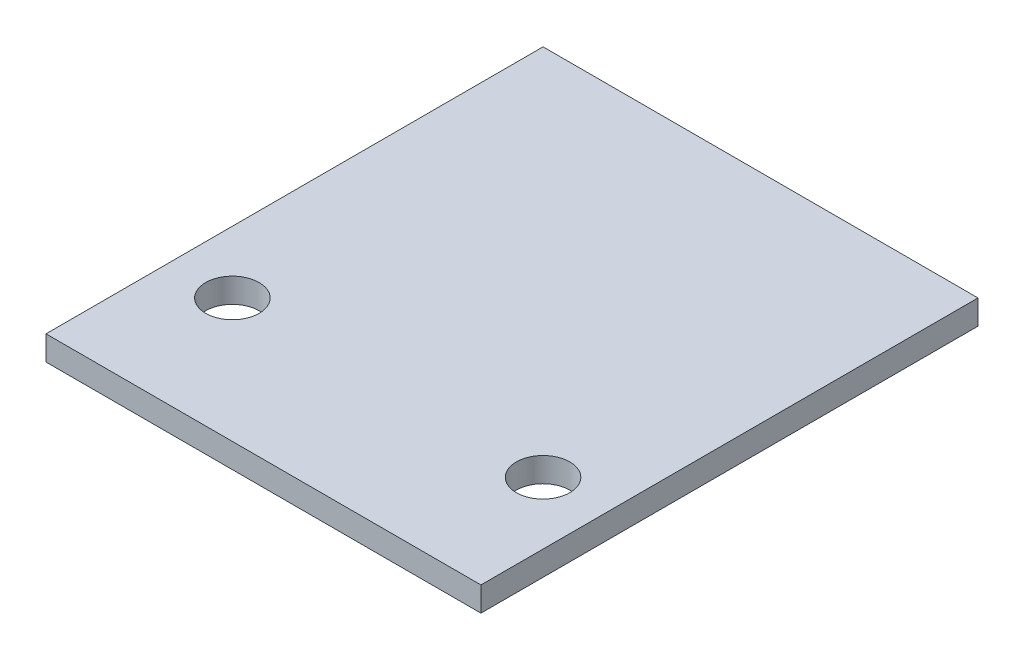
ISO-10303-21;
HEADER;
FILE_DESCRIPTION(('STEP AP214'),'2;1');
FILE_NAME('part.step','',(''),(''),'','','');
FILE_SCHEMA(('AUTOMOTIVE_DESIGN { 1 0 10303 214 1 1 1 1 }'));
ENDSEC;
DATA;
#1=APPLICATION_CONTEXT('core data for automotive mechanical design processes');
#2=APPLICATION_PROTOCOL_DEFINITION('international standard','automotive_design',2000,#1);
#3=PRODUCT_CONTEXT('',#1,'mechanical');
#4=PRODUCT('Part','Part','',(#3));
#5=PRODUCT_RELATED_PRODUCT_CATEGORY('part','',(#4));
#6=PRODUCT_DEFINITION_FORMATION('','',#4);
#7=PRODUCT_DEFINITION_CONTEXT('part definition',#1,'design');
#8=PRODUCT_DEFINITION('design','',#6,#7);
#9=PRODUCT_DEFINITION_SHAPE('','',#8);
#10=(LENGTH_UNIT() NAMED_UNIT(*) SI_UNIT(.MILLI.,.METRE.));
#11=(NAMED_UNIT(*) PLANE_ANGLE_UNIT() SI_UNIT($,.RADIAN.));
#12=(NAMED_UNIT(*) SI_UNIT($,.STERADIAN.) SOLID_ANGLE_UNIT());
#13=UNCERTAINTY_MEASURE_WITH_UNIT(LENGTH_MEASURE(1.E-05),#10,'distance_accuracy_value','');
#14=(GEOMETRIC_REPRESENTATION_CONTEXT(3) GLOBAL_UNCERTAINTY_ASSIGNED_CONTEXT((#13)) GLOBAL_UNIT_ASSIGNED_CONTEXT((#10,
#11,#12)) REPRESENTATION_CONTEXT('',''));
#15=CARTESIAN_POINT('',(0.,0.,0.));
#16=DIRECTION('',(0.,0.,1.));
#17=DIRECTION('',(1.,0.,0.));
#18=AXIS2_PLACEMENT_3D('',#15,#16,#17);
#19=CARTESIAN_POINT('',(8.89,1.,-10.16));
#20=DIRECTION('',(-1.,0.,0.));
#21=DIRECTION('',(0.,0.,1.));
#22=AXIS2_PLACEMENT_3D('',#19,#20,#21);
#23=PLANE('',#22);
#24=DIRECTION('',(0.,0.,-1.));
#25=VECTOR('',#24,1.);
#26=CARTESIAN_POINT('',(8.89,0.,-10.16));
#27=LINE('',#26,#25);
#28=CARTESIAN_POINT('',(8.89,0.,10.16));
#29=VERTEX_POINT('',#28);
#30=CARTESIAN_POINT('',(8.89,0.,-10.16));
#31=VERTEX_POINT('',#30);
#32=EDGE_CURVE('E95',#29,#31,#27,.T.);
#33=ORIENTED_EDGE('',*,*,#32,.T.);
#34=DIRECTION('',(0.,-1.,0.));
#35=VECTOR('',#34,1.);
#36=CARTESIAN_POINT('',(8.89,1.,-10.16));
#37=LINE('',#36,#35);
#38=CARTESIAN_POINT('',(8.89,1.,-10.16));
#39=VERTEX_POINT('',#38);
#40=EDGE_CURVE('E11',#39,#31,#37,.T.);
#41=ORIENTED_EDGE('',*,*,#40,.F.);
#42=DIRECTION('',(0.,0.,-1.));
#43=VECTOR('',#42,1.);
#44=CARTESIAN_POINT('',(8.89,1.,-10.16));
#45=LINE('',#44,#43);
#46=CARTESIAN_POINT('',(8.89,1.,10.16));
#47=VERTEX_POINT('',#46);
#48=EDGE_CURVE('E83',#47,#39,#45,.T.);
#49=ORIENTED_EDGE('',*,*,#48,.F.);
#50=DIRECTION('',(0.,-1.,0.));
#51=VECTOR('',#50,1.);
#52=CARTESIAN_POINT('',(8.89,1.,10.16));
#53=LINE('',#52,#51);
#54=EDGE_CURVE('E91',#47,#29,#53,.T.);
#55=ORIENTED_EDGE('',*,*,#54,.T.);
#56=EDGE_LOOP('',(#33,#41,#49,#55));
#57=FACE_BOUND('',#56,.T.);
#58=ADVANCED_FACE('F32',(#57),#23,.F.);
#59=CARTESIAN_POINT('',(-8.89,1.,-10.16));
#60=DIRECTION('',(0.,0.,1.));
#61=DIRECTION('',(1.,0.,0.));
#62=AXIS2_PLACEMENT_3D('',#59,#60,#61);
#63=PLANE('',#62);
#64=DIRECTION('',(-1.,0.,0.));
#65=VECTOR('',#64,1.);
#66=CARTESIAN_POINT('',(-8.89,0.,-10.16));
#67=LINE('',#66,#65);
#68=CARTESIAN_POINT('',(-8.89,0.,-10.16));
#69=VERTEX_POINT('',#68);
#70=EDGE_CURVE('E87',#31,#69,#67,.T.);
#71=ORIENTED_EDGE('',*,*,#70,.T.);
#72=DIRECTION('',(0.,-1.,0.));
#73=VECTOR('',#72,1.);
#74=CARTESIAN_POINT('',(-8.89,1.,-10.16));
#75=LINE('',#74,#73);
#76=CARTESIAN_POINT('',(-8.89,1.,-10.16));
#77=VERTEX_POINT('',#76);
#78=EDGE_CURVE('E40',#77,#69,#75,.T.);
#79=ORIENTED_EDGE('',*,*,#78,.F.);
#80=DIRECTION('',(-1.,0.,0.));
#81=VECTOR('',#80,1.);
#82=CARTESIAN_POINT('',(-8.89,1.,-10.16));
#83=LINE('',#82,#81);
#84=EDGE_CURVE('E78',#39,#77,#83,.T.);
#85=ORIENTED_EDGE('',*,*,#84,.F.);
#86=ORIENTED_EDGE('',*,*,#40,.T.);
#87=EDGE_LOOP('',(#71,#79,#85,#86));
#88=FACE_BOUND('',#87,.T.);
#89=ADVANCED_FACE('F86',(#88),#63,.F.);
#90=CARTESIAN_POINT('',(-8.89,1.,-10.16));
#91=DIRECTION('',(1.,0.,0.));
#92=DIRECTION('',(0.,0.,-1.));
#93=AXIS2_PLACEMENT_3D('',#90,#91,#92);
#94=PLANE('',#93);
#95=DIRECTION('',(0.,0.,1.));
#96=VECTOR('',#95,1.);
#97=CARTESIAN_POINT('',(-8.89,0.,-10.16));
#98=LINE('',#97,#96);
#99=CARTESIAN_POINT('',(-8.89,0.,10.16));
#100=VERTEX_POINT('',#99);
#101=EDGE_CURVE('E65',#69,#100,#98,.T.);
#102=ORIENTED_EDGE('',*,*,#101,.T.);
#103=DIRECTION('',(0.,-1.,0.));
#104=VECTOR('',#103,1.);
#105=CARTESIAN_POINT('',(-8.89,1.,10.16));
#106=LINE('',#105,#104);
#107=CARTESIAN_POINT('',(-8.89,1.,10.16));
#108=VERTEX_POINT('',#107);
#109=EDGE_CURVE('E88',#108,#100,#106,.T.);
#110=ORIENTED_EDGE('',*,*,#109,.F.);
#111=DIRECTION('',(0.,0.,1.));
#112=VECTOR('',#111,1.);
#113=CARTESIAN_POINT('',(-8.89,1.,-10.16));
#114=LINE('',#113,#112);
#115=EDGE_CURVE('E81',#77,#108,#114,.T.);
#116=ORIENTED_EDGE('',*,*,#115,.F.);
#117=ORIENTED_EDGE('',*,*,#78,.T.);
#118=EDGE_LOOP('',(#102,#110,#116,#117));
#119=FACE_BOUND('',#118,.T.);
#120=ADVANCED_FACE('F89',(#119),#94,.F.);
#121=CARTESIAN_POINT('',(-8.89,1.,10.16));
#122=DIRECTION('',(0.,0.,-1.));
#123=DIRECTION('',(-1.,0.,0.));
#124=AXIS2_PLACEMENT_3D('',#121,#122,#123);
#125=PLANE('',#124);
#126=DIRECTION('',(1.,0.,0.));
#127=VECTOR('',#126,1.);
#128=CARTESIAN_POINT('',(-8.89,0.,10.16));
#129=LINE('',#128,#127);
#130=EDGE_CURVE('E71',#100,#29,#129,.T.);
#131=ORIENTED_EDGE('',*,*,#130,.T.);
#132=ORIENTED_EDGE('',*,*,#54,.F.);
#133=DIRECTION('',(1.,0.,0.));
#134=VECTOR('',#133,1.);
#135=CARTESIAN_POINT('',(-8.89,1.,10.16));
#136=LINE('',#135,#134);
#137=EDGE_CURVE('E48',#108,#47,#136,.T.);
#138=ORIENTED_EDGE('',*,*,#137,.F.);
#139=ORIENTED_EDGE('',*,*,#109,.T.);
#140=EDGE_LOOP('',(#131,#132,#138,#139));
#141=FACE_BOUND('',#140,.T.);
#142=ADVANCED_FACE('F103',(#141),#125,.F.);
#143=CARTESIAN_POINT('',(0.,1.,0.));
#144=DIRECTION('',(0.,1.,0.));
#145=DIRECTION('',(0.,0.,1.));
#146=AXIS2_PLACEMENT_3D('',#143,#144,#145);
#147=PLANE('',#146);
#148=CARTESIAN_POINT('',(-6.35,1.,5.08));
#149=DIRECTION('',(0.,1.,0.));
#150=DIRECTION('',(0.,0.,1.));
#151=AXIS2_PLACEMENT_3D('',#148,#149,#150);
#152=CIRCLE('',#151,1.0922);
#153=CARTESIAN_POINT('',(-6.35,1.,6.1722));
#154=VERTEX_POINT('',#153);
#155=EDGE_CURVE('E117',#154,#154,#152,.T.);
#156=ORIENTED_EDGE('',*,*,#155,.F.);
#157=EDGE_LOOP('',(#156));
#158=FACE_BOUND('',#157,.T.);
#159=CARTESIAN_POINT('',(6.35,1.,5.08));
#160=DIRECTION('',(0.,1.,0.));
#161=DIRECTION('',(0.,0.,1.));
#162=AXIS2_PLACEMENT_3D('',#159,#160,#161);
#163=CIRCLE('',#162,1.0922);
#164=CARTESIAN_POINT('',(6.35,1.,6.1722));
#165=VERTEX_POINT('',#164);
#166=EDGE_CURVE('E111',#165,#165,#163,.T.);
#167=ORIENTED_EDGE('',*,*,#166,.F.);
#168=EDGE_LOOP('',(#167));
#169=FACE_BOUND('',#168,.T.);
#170=ORIENTED_EDGE('',*,*,#48,.T.);
#171=ORIENTED_EDGE('',*,*,#84,.T.);
#172=ORIENTED_EDGE('',*,*,#115,.T.);
#173=ORIENTED_EDGE('',*,*,#137,.T.);
#174=EDGE_LOOP('',(#170,#171,#172,#173));
#175=FACE_BOUND('',#174,.T.);
#176=ADVANCED_FACE('F79',(#158,#169,#175),#147,.T.);
#177=CARTESIAN_POINT('',(0.,0.,0.));
#178=DIRECTION('',(0.,1.,0.));
#179=DIRECTION('',(0.,0.,1.));
#180=AXIS2_PLACEMENT_3D('',#177,#178,#179);
#181=PLANE('',#180);
#182=CARTESIAN_POINT('',(-6.35,0.,5.08));
#183=DIRECTION('',(0.,1.,0.));
#184=DIRECTION('',(0.,0.,1.));
#185=AXIS2_PLACEMENT_3D('',#182,#183,#184);
#186=CIRCLE('',#185,1.0922);
#187=CARTESIAN_POINT('',(-6.35,0.,6.1722));
#188=VERTEX_POINT('',#187);
#189=EDGE_CURVE('E114',#188,#188,#186,.T.);
#190=ORIENTED_EDGE('',*,*,#189,.T.);
#191=EDGE_LOOP('',(#190));
#192=FACE_BOUND('',#191,.T.);
#193=CARTESIAN_POINT('',(6.35,0.,5.08));
#194=DIRECTION('',(0.,1.,0.));
#195=DIRECTION('',(0.,0.,1.));
#196=AXIS2_PLACEMENT_3D('',#193,#194,#195);
#197=CIRCLE('',#196,1.0922);
#198=CARTESIAN_POINT('',(6.35,0.,6.1722));
#199=VERTEX_POINT('',#198);
#200=EDGE_CURVE('E98',#199,#199,#197,.T.);
#201=ORIENTED_EDGE('',*,*,#200,.T.);
#202=EDGE_LOOP('',(#201));
#203=FACE_BOUND('',#202,.T.);
#204=ORIENTED_EDGE('',*,*,#32,.F.);
#205=ORIENTED_EDGE('',*,*,#130,.F.);
#206=ORIENTED_EDGE('',*,*,#101,.F.);
#207=ORIENTED_EDGE('',*,*,#70,.F.);
#208=EDGE_LOOP('',(#204,#205,#206,#207));
#209=FACE_BOUND('',#208,.T.);
#210=ADVANCED_FACE('F106',(#192,#203,#209),#181,.F.);
#211=CARTESIAN_POINT('',(6.35,1.,5.08));
#212=DIRECTION('',(0.,1.,0.));
#213=DIRECTION('',(0.,0.,1.));
#214=AXIS2_PLACEMENT_3D('',#211,#212,#213);
#215=CYLINDRICAL_SURFACE('',#214,1.0922);
#216=ORIENTED_EDGE('',*,*,#200,.F.);
#217=EDGE_LOOP('',(#216));
#218=FACE_BOUND('',#217,.T.);
#219=ORIENTED_EDGE('',*,*,#166,.T.);
#220=EDGE_LOOP('',(#219));
#221=FACE_BOUND('',#220,.T.);
#222=ADVANCED_FACE('F128',(#218,#221),#215,.F.);
#223=CARTESIAN_POINT('',(-6.35,1.,5.08));
#224=DIRECTION('',(0.,1.,0.));
#225=DIRECTION('',(0.,0.,1.));
#226=AXIS2_PLACEMENT_3D('',#223,#224,#225);
#227=CYLINDRICAL_SURFACE('',#226,1.0922);
#228=ORIENTED_EDGE('',*,*,#189,.F.);
#229=EDGE_LOOP('',(#228));
#230=FACE_BOUND('',#229,.T.);
#231=ORIENTED_EDGE('',*,*,#155,.T.);
#232=EDGE_LOOP('',(#231));
#233=FACE_BOUND('',#232,.T.);
#234=ADVANCED_FACE('F121',(#230,#233),#227,.F.);
#235=CLOSED_SHELL('',(#58,#89,#120,#142,#176,#210,#222,#234));
#236=MANIFOLD_SOLID_BREP('B2',#235);
#237=ADVANCED_BREP_SHAPE_REPRESENTATION('',(#18,#236),#14);
#238=SHAPE_DEFINITION_REPRESENTATION(#9,#237);
ENDSEC;
END-ISO-10303-21;
